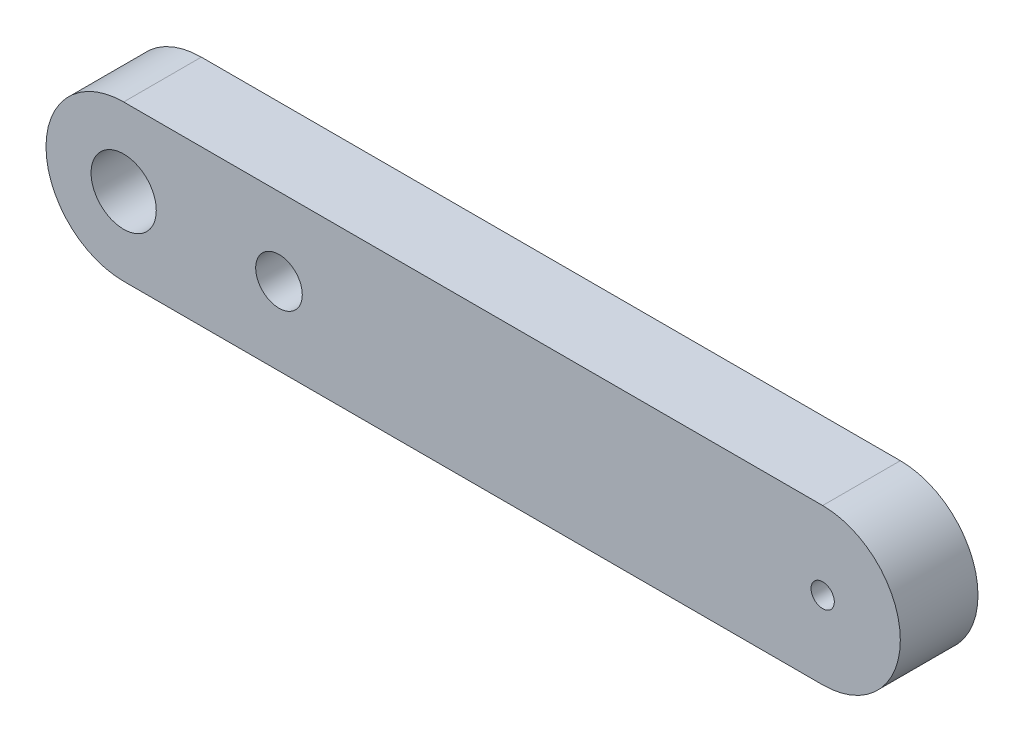
ISO-10303-21;
HEADER;
FILE_DESCRIPTION(('STEP AP214'),'2;1');
FILE_NAME('part.step','',(''),(''),'','','');
FILE_SCHEMA(('AUTOMOTIVE_DESIGN { 1 0 10303 214 1 1 1 1 }'));
ENDSEC;
DATA;
#1=APPLICATION_CONTEXT('core data for automotive mechanical design processes');
#2=APPLICATION_PROTOCOL_DEFINITION('international standard','automotive_design',2000,#1);
#3=PRODUCT_CONTEXT('',#1,'mechanical');
#4=PRODUCT('Part','Part','',(#3));
#5=PRODUCT_RELATED_PRODUCT_CATEGORY('part','',(#4));
#6=PRODUCT_DEFINITION_FORMATION('','',#4);
#7=PRODUCT_DEFINITION_CONTEXT('part definition',#1,'design');
#8=PRODUCT_DEFINITION('design','',#6,#7);
#9=PRODUCT_DEFINITION_SHAPE('','',#8);
#10=(LENGTH_UNIT() NAMED_UNIT(*) SI_UNIT(.MILLI.,.METRE.));
#11=(NAMED_UNIT(*) PLANE_ANGLE_UNIT() SI_UNIT($,.RADIAN.));
#12=(NAMED_UNIT(*) SI_UNIT($,.STERADIAN.) SOLID_ANGLE_UNIT());
#13=UNCERTAINTY_MEASURE_WITH_UNIT(LENGTH_MEASURE(1.E-05),#10,'distance_accuracy_value','');
#14=(GEOMETRIC_REPRESENTATION_CONTEXT(3) GLOBAL_UNCERTAINTY_ASSIGNED_CONTEXT((#13)) GLOBAL_UNIT_ASSIGNED_CONTEXT((#10,
#11,#12)) REPRESENTATION_CONTEXT('',''));
#15=CARTESIAN_POINT('',(0.,0.,0.));
#16=DIRECTION('',(0.,0.,1.));
#17=DIRECTION('',(1.,0.,0.));
#18=AXIS2_PLACEMENT_3D('',#15,#16,#17);
#19=CARTESIAN_POINT('',(-81.5176145612391,31.7884728583047,0.));
#20=DIRECTION('',(0.,0.,1.));
#21=DIRECTION('',(1.,0.,0.));
#22=AXIS2_PLACEMENT_3D('',#19,#20,#21);
#23=PLANE('',#22);
#24=CARTESIAN_POINT('',(-81.5176145612391,31.7884728583047,0.));
#25=DIRECTION('',(0.,0.,1.));
#26=DIRECTION('',(1.,0.,0.));
#27=AXIS2_PLACEMENT_3D('',#24,#25,#26);
#28=CIRCLE('',#27,2.1);
#29=CARTESIAN_POINT('',(-79.4176145612391,31.7884728583047,0.));
#30=VERTEX_POINT('',#29);
#31=EDGE_CURVE('E132',#30,#30,#28,.T.);
#32=ORIENTED_EDGE('',*,*,#31,.T.);
#33=EDGE_LOOP('',(#32));
#34=FACE_BOUND('',#33,.T.);
#35=CARTESIAN_POINT('',(-71.5176145612391,31.7884728583047,0.));
#36=DIRECTION('',(0.,0.,1.));
#37=DIRECTION('',(1.,0.,0.));
#38=AXIS2_PLACEMENT_3D('',#35,#36,#37);
#39=CIRCLE('',#38,1.5);
#40=CARTESIAN_POINT('',(-70.0176145612391,31.7884728583047,0.));
#41=VERTEX_POINT('',#40);
#42=EDGE_CURVE('E37',#41,#41,#39,.T.);
#43=ORIENTED_EDGE('',*,*,#42,.T.);
#44=EDGE_LOOP('',(#43));
#45=FACE_BOUND('',#44,.T.);
#46=CARTESIAN_POINT('',(-81.5176145612391,31.7884728583047,0.));
#47=DIRECTION('',(0.,0.,1.));
#48=DIRECTION('',(1.,0.,0.));
#49=AXIS2_PLACEMENT_3D('',#46,#47,#48);
#50=CIRCLE('',#49,5.);
#51=CARTESIAN_POINT('',(-81.5176145612391,36.7884728583047,0.));
#52=VERTEX_POINT('',#51);
#53=CARTESIAN_POINT('',(-81.5176145612391,26.7884728583047,0.));
#54=VERTEX_POINT('',#53);
#55=EDGE_CURVE('E80',#52,#54,#50,.T.);
#56=ORIENTED_EDGE('',*,*,#55,.F.);
#57=DIRECTION('',(-1.,0.,0.));
#58=VECTOR('',#57,1.);
#59=CARTESIAN_POINT('',(-81.5176145612391,36.7884728583047,0.));
#60=LINE('',#59,#58);
#61=CARTESIAN_POINT('',(-36.5176145612391,36.7884728583047,0.));
#62=VERTEX_POINT('',#61);
#63=EDGE_CURVE('E49',#62,#52,#60,.T.);
#64=ORIENTED_EDGE('',*,*,#63,.F.);
#65=CARTESIAN_POINT('',(-36.5176145612391,31.7884728583047,0.));
#66=DIRECTION('',(0.,0.,1.));
#67=DIRECTION('',(1.,0.,0.));
#68=AXIS2_PLACEMENT_3D('',#65,#66,#67);
#69=CIRCLE('',#68,5.);
#70=CARTESIAN_POINT('',(-36.5176145612391,26.7884728583047,0.));
#71=VERTEX_POINT('',#70);
#72=EDGE_CURVE('E57',#71,#62,#69,.T.);
#73=ORIENTED_EDGE('',*,*,#72,.F.);
#74=DIRECTION('',(1.,0.,0.));
#75=VECTOR('',#74,1.);
#76=CARTESIAN_POINT('',(-36.5176145612391,26.7884728583047,0.));
#77=LINE('',#76,#75);
#78=EDGE_CURVE('E108',#54,#71,#77,.T.);
#79=ORIENTED_EDGE('',*,*,#78,.F.);
#80=EDGE_LOOP('',(#56,#64,#73,#79));
#81=FACE_BOUND('',#80,.T.);
#82=CARTESIAN_POINT('',(-36.5176145612391,31.7884728583047,0.));
#83=DIRECTION('',(0.,0.,1.));
#84=DIRECTION('',(1.,0.,0.));
#85=AXIS2_PLACEMENT_3D('',#82,#83,#84);
#86=CIRCLE('',#85,0.749999999999999);
#87=CARTESIAN_POINT('',(-35.7676145612391,31.7884728583047,0.));
#88=VERTEX_POINT('',#87);
#89=EDGE_CURVE('E104',#88,#88,#86,.T.);
#90=ORIENTED_EDGE('',*,*,#89,.T.);
#91=EDGE_LOOP('',(#90));
#92=FACE_BOUND('',#91,.T.);
#93=ADVANCED_FACE('F33',(#34,#45,#81,#92),#23,.F.);
#94=CARTESIAN_POINT('',(-81.5176145612391,31.7884728583047,4.));
#95=DIRECTION('',(0.,0.,-1.));
#96=DIRECTION('',(-1.,0.,0.));
#97=AXIS2_PLACEMENT_3D('',#94,#95,#96);
#98=CYLINDRICAL_SURFACE('',#97,5.);
#99=ORIENTED_EDGE('',*,*,#55,.T.);
#100=DIRECTION('',(0.,0.,-1.));
#101=VECTOR('',#100,1.);
#102=CARTESIAN_POINT('',(-81.5176145612391,26.7884728583047,4.));
#103=LINE('',#102,#101);
#104=CARTESIAN_POINT('',(-81.5176145612391,26.7884728583047,5.));
#105=VERTEX_POINT('',#104);
#106=EDGE_CURVE('E11',#105,#54,#103,.T.);
#107=ORIENTED_EDGE('',*,*,#106,.F.);
#108=CARTESIAN_POINT('',(-81.5176145612391,31.7884728583047,5.));
#109=DIRECTION('',(0.,0.,1.));
#110=DIRECTION('',(1.,0.,0.));
#111=AXIS2_PLACEMENT_3D('',#108,#109,#110);
#112=CIRCLE('',#111,5.);
#113=CARTESIAN_POINT('',(-81.5176145612391,36.7884728583047,5.));
#114=VERTEX_POINT('',#113);
#115=EDGE_CURVE('E78',#114,#105,#112,.T.);
#116=ORIENTED_EDGE('',*,*,#115,.F.);
#117=DIRECTION('',(0.,0.,-1.));
#118=VECTOR('',#117,1.);
#119=CARTESIAN_POINT('',(-81.5176145612391,36.7884728583047,4.));
#120=LINE('',#119,#118);
#121=EDGE_CURVE('E112',#114,#52,#120,.T.);
#122=ORIENTED_EDGE('',*,*,#121,.T.);
#123=EDGE_LOOP('',(#99,#107,#116,#122));
#124=FACE_BOUND('',#123,.T.);
#125=ADVANCED_FACE('F35',(#124),#98,.T.);
#126=CARTESIAN_POINT('',(-36.5176145612391,26.7884728583047,4.));
#127=DIRECTION('',(0.,1.,0.));
#128=DIRECTION('',(0.,0.,1.));
#129=AXIS2_PLACEMENT_3D('',#126,#127,#128);
#130=PLANE('',#129);
#131=ORIENTED_EDGE('',*,*,#78,.T.);
#132=DIRECTION('',(0.,0.,-1.));
#133=VECTOR('',#132,1.);
#134=CARTESIAN_POINT('',(-36.5176145612391,26.7884728583047,4.));
#135=LINE('',#134,#133);
#136=CARTESIAN_POINT('',(-36.5176145612391,26.7884728583047,5.));
#137=VERTEX_POINT('',#136);
#138=EDGE_CURVE('E42',#137,#71,#135,.T.);
#139=ORIENTED_EDGE('',*,*,#138,.F.);
#140=DIRECTION('',(1.,0.,0.));
#141=VECTOR('',#140,1.);
#142=CARTESIAN_POINT('',(-81.5176145612391,26.7884728583047,5.));
#143=LINE('',#142,#141);
#144=EDGE_CURVE('E83',#105,#137,#143,.T.);
#145=ORIENTED_EDGE('',*,*,#144,.F.);
#146=ORIENTED_EDGE('',*,*,#106,.T.);
#147=EDGE_LOOP('',(#131,#139,#145,#146));
#148=FACE_BOUND('',#147,.T.);
#149=ADVANCED_FACE('F84',(#148),#130,.F.);
#150=CARTESIAN_POINT('',(-36.5176145612391,31.7884728583047,4.));
#151=DIRECTION('',(0.,0.,-1.));
#152=DIRECTION('',(-1.,0.,0.));
#153=AXIS2_PLACEMENT_3D('',#150,#151,#152);
#154=CYLINDRICAL_SURFACE('',#153,5.);
#155=ORIENTED_EDGE('',*,*,#72,.T.);
#156=DIRECTION('',(0.,0.,-1.));
#157=VECTOR('',#156,1.);
#158=CARTESIAN_POINT('',(-36.5176145612391,36.7884728583047,4.));
#159=LINE('',#158,#157);
#160=CARTESIAN_POINT('',(-36.5176145612391,36.7884728583047,5.));
#161=VERTEX_POINT('',#160);
#162=EDGE_CURVE('E114',#161,#62,#159,.T.);
#163=ORIENTED_EDGE('',*,*,#162,.F.);
#164=CARTESIAN_POINT('',(-36.5176145612391,31.7884728583047,5.));
#165=DIRECTION('',(0.,0.,1.));
#166=DIRECTION('',(1.,0.,0.));
#167=AXIS2_PLACEMENT_3D('',#164,#165,#166);
#168=CIRCLE('',#167,5.);
#169=EDGE_CURVE('E88',#137,#161,#168,.T.);
#170=ORIENTED_EDGE('',*,*,#169,.F.);
#171=ORIENTED_EDGE('',*,*,#138,.T.);
#172=EDGE_LOOP('',(#155,#163,#170,#171));
#173=FACE_BOUND('',#172,.T.);
#174=ADVANCED_FACE('F116',(#173),#154,.T.);
#175=CARTESIAN_POINT('',(-81.5176145612391,36.7884728583047,4.));
#176=DIRECTION('',(0.,-1.,0.));
#177=DIRECTION('',(0.,0.,-1.));
#178=AXIS2_PLACEMENT_3D('',#175,#176,#177);
#179=PLANE('',#178);
#180=ORIENTED_EDGE('',*,*,#63,.T.);
#181=ORIENTED_EDGE('',*,*,#121,.F.);
#182=DIRECTION('',(-1.,0.,0.));
#183=VECTOR('',#182,1.);
#184=CARTESIAN_POINT('',(-81.5176145612391,36.7884728583047,5.));
#185=LINE('',#184,#183);
#186=EDGE_CURVE('E94',#161,#114,#185,.T.);
#187=ORIENTED_EDGE('',*,*,#186,.F.);
#188=ORIENTED_EDGE('',*,*,#162,.T.);
#189=EDGE_LOOP('',(#180,#181,#187,#188));
#190=FACE_BOUND('',#189,.T.);
#191=ADVANCED_FACE('F128',(#190),#179,.F.);
#192=CARTESIAN_POINT('',(-36.5176145612391,31.7884728583047,4.));
#193=DIRECTION('',(0.,0.,-1.));
#194=DIRECTION('',(-1.,0.,0.));
#195=AXIS2_PLACEMENT_3D('',#192,#193,#194);
#196=CYLINDRICAL_SURFACE('',#195,0.749999999999999);
#197=ORIENTED_EDGE('',*,*,#89,.F.);
#198=EDGE_LOOP('',(#197));
#199=FACE_BOUND('',#198,.T.);
#200=CARTESIAN_POINT('',(-36.5176145612391,31.7884728583047,5.));
#201=DIRECTION('',(0.,0.,1.));
#202=DIRECTION('',(1.,0.,0.));
#203=AXIS2_PLACEMENT_3D('',#200,#201,#202);
#204=CIRCLE('',#203,0.749999999999999);
#205=CARTESIAN_POINT('',(-35.7676145612391,31.7884728583047,5.));
#206=VERTEX_POINT('',#205);
#207=EDGE_CURVE('E98',#206,#206,#204,.T.);
#208=ORIENTED_EDGE('',*,*,#207,.T.);
#209=EDGE_LOOP('',(#208));
#210=FACE_BOUND('',#209,.T.);
#211=ADVANCED_FACE('F124',(#199,#210),#196,.F.);
#212=CARTESIAN_POINT('',(-71.5176145612391,31.7884728583047,-6.));
#213=DIRECTION('',(0.,0.,1.));
#214=DIRECTION('',(1.,0.,0.));
#215=AXIS2_PLACEMENT_3D('',#212,#213,#214);
#216=CYLINDRICAL_SURFACE('',#215,1.5);
#217=ORIENTED_EDGE('',*,*,#42,.F.);
#218=EDGE_LOOP('',(#217));
#219=FACE_BOUND('',#218,.T.);
#220=CARTESIAN_POINT('',(-71.5176145612391,31.7884728583047,5.));
#221=DIRECTION('',(0.,0.,1.));
#222=DIRECTION('',(1.,0.,0.));
#223=AXIS2_PLACEMENT_3D('',#220,#221,#222);
#224=CIRCLE('',#223,1.5);
#225=CARTESIAN_POINT('',(-70.0176145612391,31.7884728583047,5.));
#226=VERTEX_POINT('',#225);
#227=EDGE_CURVE('E95',#226,#226,#224,.T.);
#228=ORIENTED_EDGE('',*,*,#227,.T.);
#229=EDGE_LOOP('',(#228));
#230=FACE_BOUND('',#229,.T.);
#231=ADVANCED_FACE('F127',(#219,#230),#216,.F.);
#232=CARTESIAN_POINT('',(-81.5176145612391,31.7884728583047,5.));
#233=DIRECTION('',(0.,0.,1.));
#234=DIRECTION('',(1.,0.,0.));
#235=AXIS2_PLACEMENT_3D('',#232,#233,#234);
#236=PLANE('',#235);
#237=CARTESIAN_POINT('',(-81.5176145612391,31.7884728583047,5.));
#238=DIRECTION('',(0.,0.,1.));
#239=DIRECTION('',(1.,0.,0.));
#240=AXIS2_PLACEMENT_3D('',#237,#238,#239);
#241=CIRCLE('',#240,2.1);
#242=CARTESIAN_POINT('',(-79.4176145612391,31.7884728583047,5.));
#243=VERTEX_POINT('',#242);
#244=EDGE_CURVE('E134',#243,#243,#241,.T.);
#245=ORIENTED_EDGE('',*,*,#244,.F.);
#246=EDGE_LOOP('',(#245));
#247=FACE_BOUND('',#246,.T.);
#248=ORIENTED_EDGE('',*,*,#227,.F.);
#249=EDGE_LOOP('',(#248));
#250=FACE_BOUND('',#249,.T.);
#251=ORIENTED_EDGE('',*,*,#115,.T.);
#252=ORIENTED_EDGE('',*,*,#144,.T.);
#253=ORIENTED_EDGE('',*,*,#169,.T.);
#254=ORIENTED_EDGE('',*,*,#186,.T.);
#255=EDGE_LOOP('',(#251,#252,#253,#254));
#256=FACE_BOUND('',#255,.T.);
#257=ORIENTED_EDGE('',*,*,#207,.F.);
#258=EDGE_LOOP('',(#257));
#259=FACE_BOUND('',#258,.T.);
#260=ADVANCED_FACE('F91',(#247,#250,#256,#259),#236,.T.);
#261=CARTESIAN_POINT('',(-81.5176145612391,31.7884728583047,-5.));
#262=DIRECTION('',(0.,0.,1.));
#263=DIRECTION('',(1.,0.,0.));
#264=AXIS2_PLACEMENT_3D('',#261,#262,#263);
#265=CYLINDRICAL_SURFACE('',#264,2.1);
#266=ORIENTED_EDGE('',*,*,#244,.T.);
#267=EDGE_LOOP('',(#266));
#268=FACE_BOUND('',#267,.T.);
#269=ORIENTED_EDGE('',*,*,#31,.F.);
#270=EDGE_LOOP('',(#269));
#271=FACE_BOUND('',#270,.T.);
#272=ADVANCED_FACE('F140',(#268,#271),#265,.F.);
#273=CLOSED_SHELL('',(#93,#125,#149,#174,#191,#211,#231,#260,#272));
#274=MANIFOLD_SOLID_BREP('B2',#273);
#275=ADVANCED_BREP_SHAPE_REPRESENTATION('',(#18,#274),#14);
#276=SHAPE_DEFINITION_REPRESENTATION(#9,#275);
ENDSEC;
END-ISO-10303-21;
